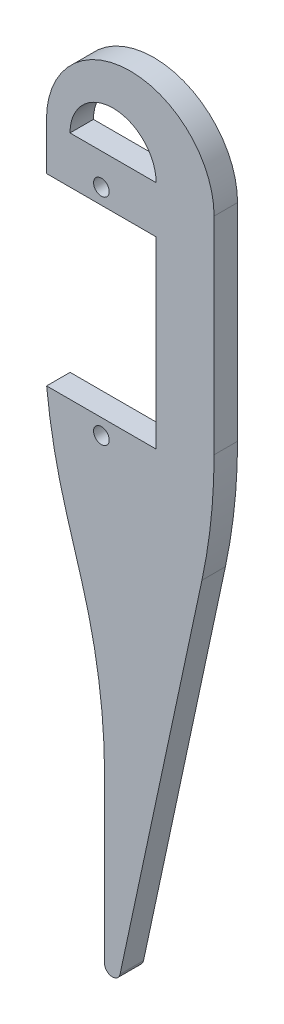
ISO-10303-21;
HEADER;
FILE_DESCRIPTION(('STEP AP214'),'2;1');
FILE_NAME('part.step','',(''),(''),'','','');
FILE_SCHEMA(('AUTOMOTIVE_DESIGN { 1 0 10303 214 1 1 1 1 }'));
ENDSEC;
DATA;
#1=APPLICATION_CONTEXT('core data for automotive mechanical design processes');
#2=APPLICATION_PROTOCOL_DEFINITION('international standard','automotive_design',2000,#1);
#3=PRODUCT_CONTEXT('',#1,'mechanical');
#4=PRODUCT('Part','Part','',(#3));
#5=PRODUCT_RELATED_PRODUCT_CATEGORY('part','',(#4));
#6=PRODUCT_DEFINITION_FORMATION('','',#4);
#7=PRODUCT_DEFINITION_CONTEXT('part definition',#1,'design');
#8=PRODUCT_DEFINITION('design','',#6,#7);
#9=PRODUCT_DEFINITION_SHAPE('','',#8);
#10=(LENGTH_UNIT() NAMED_UNIT(*) SI_UNIT(.MILLI.,.METRE.));
#11=(NAMED_UNIT(*) PLANE_ANGLE_UNIT() SI_UNIT($,.RADIAN.));
#12=(NAMED_UNIT(*) SI_UNIT($,.STERADIAN.) SOLID_ANGLE_UNIT());
#13=UNCERTAINTY_MEASURE_WITH_UNIT(LENGTH_MEASURE(1.E-05),#10,'distance_accuracy_value','');
#14=(GEOMETRIC_REPRESENTATION_CONTEXT(3) GLOBAL_UNCERTAINTY_ASSIGNED_CONTEXT((#13)) GLOBAL_UNIT_ASSIGNED_CONTEXT((#10,
#11,#12)) REPRESENTATION_CONTEXT('',''));
#15=CARTESIAN_POINT('',(0.,0.,0.));
#16=DIRECTION('',(0.,0.,1.));
#17=DIRECTION('',(1.,0.,0.));
#18=AXIS2_PLACEMENT_3D('',#15,#16,#17);
#19=CARTESIAN_POINT('',(-48.5539801961464,24.533720680881,3.));
#20=DIRECTION('',(0.,0.,-1.));
#21=DIRECTION('',(-1.,0.,0.));
#22=AXIS2_PLACEMENT_3D('',#19,#20,#21);
#23=PLANE('',#22);
#24=DIRECTION('',(-1.,0.,0.));
#25=VECTOR('',#24,1.);
#26=CARTESIAN_POINT('',(-45.247809755199,-4.96627931911898,3.));
#27=LINE('',#26,#25);
#28=CARTESIAN_POINT('',(-45.247809755199,-4.96627931911898,3.));
#29=VERTEX_POINT('',#28);
#30=CARTESIAN_POINT('',(-59.247809755199,-4.96627931911899,3.));
#31=VERTEX_POINT('',#30);
#32=EDGE_CURVE('E181',#29,#31,#27,.T.);
#33=ORIENTED_EDGE('',*,*,#32,.T.);
#34=CARTESIAN_POINT('',(10.3897967185846,2.14735298811001,3.));
#35=DIRECTION('',(0.,0.,-1.));
#36=DIRECTION('',(-1.,0.,0.));
#37=AXIS2_PLACEMENT_3D('',#34,#35,#36);
#38=CIRCLE('',#37,70.);
#39=CARTESIAN_POINT('',(-56.6755761014866,-17.9084633379549,3.));
#40=VERTEX_POINT('',#39);
#41=EDGE_CURVE('E252',#31,#40,#38,.F.);
#42=ORIENTED_EDGE('',*,*,#41,.T.);
#43=DIRECTION('',(0.286511661800927,-0.958076754572446,0.));
#44=VECTOR('',#43,1.);
#45=CARTESIAN_POINT('',(-51.8378845095338,-34.0853960006852,3.));
#46=LINE('',#45,#44);
#47=CARTESIAN_POINT('',(-54.7725116894626,-24.2721895617103,3.));
#48=VERTEX_POINT('',#47);
#49=EDGE_CURVE('E183',#40,#48,#46,.T.);
#50=ORIENTED_EDGE('',*,*,#49,.T.);
#51=CARTESIAN_POINT('',(-121.837884509534,-44.3280058877752,3.));
#52=DIRECTION('',(0.,0.,-1.));
#53=DIRECTION('',(-1.,0.,0.));
#54=AXIS2_PLACEMENT_3D('',#51,#52,#53);
#55=CIRCLE('',#54,70.);
#56=CARTESIAN_POINT('',(-51.8378845095338,-44.3280058877752,3.));
#57=VERTEX_POINT('',#56);
#58=EDGE_CURVE('E11',#48,#57,#55,.T.);
#59=ORIENTED_EDGE('',*,*,#58,.T.);
#60=DIRECTION('',(0.,-1.,0.));
#61=VECTOR('',#60,1.);
#62=CARTESIAN_POINT('',(-51.8378845095338,-34.0853960006852,3.));
#63=LINE('',#62,#61);
#64=CARTESIAN_POINT('',(-51.8378845095338,-65.2023030407031,3.));
#65=VERTEX_POINT('',#64);
#66=EDGE_CURVE('E186',#57,#65,#63,.T.);
#67=ORIENTED_EDGE('',*,*,#66,.T.);
#68=CARTESIAN_POINT('',(-50.8378845095338,-65.2023030407034,3.));
#69=DIRECTION('',(0.,0.,1.));
#70=DIRECTION('',(1.,0.,0.));
#71=AXIS2_PLACEMENT_3D('',#68,#69,#70);
#72=CIRCLE('',#71,1.);
#73=CARTESIAN_POINT('',(-49.8600799319517,-65.4118220328244,3.));
#74=VERTEX_POINT('',#73);
#75=EDGE_CURVE('E188',#65,#74,#72,.T.);
#76=ORIENTED_EDGE('',*,*,#75,.T.);
#77=DIRECTION('',(0.209518992121353,0.977804577582071,0.));
#78=VECTOR('',#77,1.);
#79=CARTESIAN_POINT('',(-49.8600799319517,-65.4118220328244,3.));
#80=LINE('',#79,#78);
#81=CARTESIAN_POINT('',(-39.3919202305815,-16.5579478745744,3.));
#82=VERTEX_POINT('',#81);
#83=EDGE_CURVE('E190',#74,#82,#80,.T.);
#84=ORIENTED_EDGE('',*,*,#83,.T.);
#85=CARTESIAN_POINT('',(-107.838240661326,-1.89161842607966,3.));
#86=DIRECTION('',(0.,0.,-1.));
#87=DIRECTION('',(-1.,0.,0.));
#88=AXIS2_PLACEMENT_3D('',#85,#86,#87);
#89=CIRCLE('',#88,70.);
#90=CARTESIAN_POINT('',(-37.8382406613264,-1.89161842607969,3.));
#91=VERTEX_POINT('',#90);
#92=EDGE_CURVE('E49',#82,#91,#89,.F.);
#93=ORIENTED_EDGE('',*,*,#92,.T.);
#94=DIRECTION('',(0.,1.,0.));
#95=VECTOR('',#94,1.);
#96=CARTESIAN_POINT('',(-37.8382406613264,-9.30707777668185,3.));
#97=LINE('',#96,#95);
#98=CARTESIAN_POINT('',(-37.8382406613264,24.533720680881,3.));
#99=VERTEX_POINT('',#98);
#100=EDGE_CURVE('E192',#91,#99,#97,.T.);
#101=ORIENTED_EDGE('',*,*,#100,.T.);
#102=CARTESIAN_POINT('',(-48.5539801961464,24.533720680881,3.));
#103=DIRECTION('',(0.,0.,1.));
#104=DIRECTION('',(-1.,0.,0.));
#105=AXIS2_PLACEMENT_3D('',#102,#103,#104);
#106=CIRCLE('',#105,10.7157395348199);
#107=CARTESIAN_POINT('',(-59.2697197309663,24.533720680881,3.));
#108=VERTEX_POINT('',#107);
#109=EDGE_CURVE('E171',#99,#108,#106,.T.);
#110=ORIENTED_EDGE('',*,*,#109,.T.);
#111=DIRECTION('',(0.,-1.,0.));
#112=VECTOR('',#111,1.);
#113=CARTESIAN_POINT('',(-59.2697197309663,24.533720680881,3.));
#114=LINE('',#113,#112);
#115=CARTESIAN_POINT('',(-59.2697197309663,18.533720680881,3.));
#116=VERTEX_POINT('',#115);
#117=EDGE_CURVE('E174',#108,#116,#114,.T.);
#118=ORIENTED_EDGE('',*,*,#117,.T.);
#119=DIRECTION('',(1.,0.,0.));
#120=VECTOR('',#119,1.);
#121=CARTESIAN_POINT('',(-59.2697197309663,18.533720680881,3.));
#122=LINE('',#121,#120);
#123=CARTESIAN_POINT('',(-45.247809755199,18.533720680881,3.));
#124=VERTEX_POINT('',#123);
#125=EDGE_CURVE('E177',#116,#124,#122,.T.);
#126=ORIENTED_EDGE('',*,*,#125,.T.);
#127=DIRECTION('',(0.,-1.,0.));
#128=VECTOR('',#127,1.);
#129=CARTESIAN_POINT('',(-45.247809755199,18.533720680881,3.));
#130=LINE('',#129,#128);
#131=EDGE_CURVE('E179',#124,#29,#130,.T.);
#132=ORIENTED_EDGE('',*,*,#131,.T.);
#133=EDGE_LOOP('',(#33,#42,#50,#59,#67,#76,#84,#93,#101,#110,#118,#126,#132));
#134=FACE_BOUND('',#133,.T.);
#135=CARTESIAN_POINT('',(-50.7532872491408,24.533720680881,3.));
#136=DIRECTION('',(0.,0.,1.));
#137=DIRECTION('',(1.,0.,0.));
#138=AXIS2_PLACEMENT_3D('',#135,#136,#137);
#139=CIRCLE('',#138,5.50547749394183);
#140=CARTESIAN_POINT('',(-45.247809755199,24.533720680881,3.));
#141=VERTEX_POINT('',#140);
#142=CARTESIAN_POINT('',(-56.2587647430826,24.533720680881,3.));
#143=VERTEX_POINT('',#142);
#144=EDGE_CURVE('E152',#141,#143,#139,.T.);
#145=ORIENTED_EDGE('',*,*,#144,.F.);
#146=DIRECTION('',(1.,0.,0.));
#147=VECTOR('',#146,1.);
#148=CARTESIAN_POINT('',(-45.247809755199,24.533720680881,3.));
#149=LINE('',#148,#147);
#150=EDGE_CURVE('E142',#143,#141,#149,.T.);
#151=ORIENTED_EDGE('',*,*,#150,.F.);
#152=EDGE_LOOP('',(#145,#151));
#153=FACE_BOUND('',#152,.T.);
#154=CARTESIAN_POINT('',(-52.247809755199,20.533720680881,3.));
#155=DIRECTION('',(0.,0.,1.));
#156=DIRECTION('',(1.,0.,0.));
#157=AXIS2_PLACEMENT_3D('',#154,#155,#156);
#158=CIRCLE('',#157,0.999999999999998);
#159=CARTESIAN_POINT('',(-51.247809755199,20.533720680881,3.));
#160=VERTEX_POINT('',#159);
#161=EDGE_CURVE('E167',#160,#160,#158,.T.);
#162=ORIENTED_EDGE('',*,*,#161,.F.);
#163=EDGE_LOOP('',(#162));
#164=FACE_BOUND('',#163,.T.);
#165=CARTESIAN_POINT('',(-52.247809755199,-6.96627931911898,3.));
#166=DIRECTION('',(0.,0.,1.));
#167=DIRECTION('',(1.,0.,0.));
#168=AXIS2_PLACEMENT_3D('',#165,#166,#167);
#169=CIRCLE('',#168,0.999999999999998);
#170=CARTESIAN_POINT('',(-51.247809755199,-6.96627931911898,3.));
#171=VERTEX_POINT('',#170);
#172=EDGE_CURVE('E485',#171,#171,#169,.T.);
#173=ORIENTED_EDGE('',*,*,#172,.F.);
#174=EDGE_LOOP('',(#173));
#175=FACE_BOUND('',#174,.T.);
#176=ADVANCED_FACE('F34',(#134,#153,#164,#175),#23,.F.);
#177=CARTESIAN_POINT('',(-48.5539801961464,24.533720680881,0.));
#178=DIRECTION('',(0.,0.,-1.));
#179=DIRECTION('',(-1.,0.,0.));
#180=AXIS2_PLACEMENT_3D('',#177,#178,#179);
#181=PLANE('',#180);
#182=CARTESIAN_POINT('',(-52.247809755199,20.533720680881,0.));
#183=DIRECTION('',(0.,0.,1.));
#184=DIRECTION('',(1.,0.,0.));
#185=AXIS2_PLACEMENT_3D('',#182,#183,#184);
#186=CIRCLE('',#185,0.999999999999998);
#187=CARTESIAN_POINT('',(-51.247809755199,20.533720680881,0.));
#188=VERTEX_POINT('',#187);
#189=EDGE_CURVE('E164',#188,#188,#186,.T.);
#190=ORIENTED_EDGE('',*,*,#189,.T.);
#191=EDGE_LOOP('',(#190));
#192=FACE_BOUND('',#191,.T.);
#193=DIRECTION('',(0.286511661800927,-0.958076754572446,0.));
#194=VECTOR('',#193,1.);
#195=CARTESIAN_POINT('',(-51.8378845095338,-34.0853960006852,0.));
#196=LINE('',#195,#194);
#197=CARTESIAN_POINT('',(-56.6755761014866,-17.9084633379549,0.));
#198=VERTEX_POINT('',#197);
#199=CARTESIAN_POINT('',(-54.7725116894626,-24.2721895617103,0.));
#200=VERTEX_POINT('',#199);
#201=EDGE_CURVE('E206',#198,#200,#196,.T.);
#202=ORIENTED_EDGE('',*,*,#201,.F.);
#203=CARTESIAN_POINT('',(10.3897967185846,2.14735298811001,0.));
#204=DIRECTION('',(0.,0.,-1.));
#205=DIRECTION('',(-1.,0.,0.));
#206=AXIS2_PLACEMENT_3D('',#203,#204,#205);
#207=CIRCLE('',#206,70.);
#208=CARTESIAN_POINT('',(-59.247809755199,-4.96627931911899,0.));
#209=VERTEX_POINT('',#208);
#210=EDGE_CURVE('E249',#198,#209,#207,.T.);
#211=ORIENTED_EDGE('',*,*,#210,.T.);
#212=DIRECTION('',(-1.,0.,0.));
#213=VECTOR('',#212,1.);
#214=CARTESIAN_POINT('',(-45.247809755199,-4.96627931911898,0.));
#215=LINE('',#214,#213);
#216=CARTESIAN_POINT('',(-45.247809755199,-4.96627931911898,0.));
#217=VERTEX_POINT('',#216);
#218=EDGE_CURVE('E203',#217,#209,#215,.T.);
#219=ORIENTED_EDGE('',*,*,#218,.F.);
#220=DIRECTION('',(0.,-1.,0.));
#221=VECTOR('',#220,1.);
#222=CARTESIAN_POINT('',(-45.247809755199,18.533720680881,0.));
#223=LINE('',#222,#221);
#224=CARTESIAN_POINT('',(-45.247809755199,18.533720680881,0.));
#225=VERTEX_POINT('',#224);
#226=EDGE_CURVE('E201',#225,#217,#223,.T.);
#227=ORIENTED_EDGE('',*,*,#226,.F.);
#228=DIRECTION('',(1.,0.,0.));
#229=VECTOR('',#228,1.);
#230=CARTESIAN_POINT('',(-59.2697197309663,18.533720680881,0.));
#231=LINE('',#230,#229);
#232=CARTESIAN_POINT('',(-59.2697197309663,18.533720680881,0.));
#233=VERTEX_POINT('',#232);
#234=EDGE_CURVE('E199',#233,#225,#231,.T.);
#235=ORIENTED_EDGE('',*,*,#234,.F.);
#236=DIRECTION('',(0.,-1.,0.));
#237=VECTOR('',#236,1.);
#238=CARTESIAN_POINT('',(-59.2697197309663,24.533720680881,0.));
#239=LINE('',#238,#237);
#240=CARTESIAN_POINT('',(-59.2697197309663,24.533720680881,0.));
#241=VERTEX_POINT('',#240);
#242=EDGE_CURVE('E197',#241,#233,#239,.T.);
#243=ORIENTED_EDGE('',*,*,#242,.F.);
#244=CARTESIAN_POINT('',(-48.5539801961464,24.533720680881,0.));
#245=DIRECTION('',(0.,0.,1.));
#246=DIRECTION('',(-1.,0.,0.));
#247=AXIS2_PLACEMENT_3D('',#244,#245,#246);
#248=CIRCLE('',#247,10.7157395348199);
#249=CARTESIAN_POINT('',(-37.8382406613264,24.533720680881,0.));
#250=VERTEX_POINT('',#249);
#251=EDGE_CURVE('E170',#250,#241,#248,.T.);
#252=ORIENTED_EDGE('',*,*,#251,.F.);
#253=DIRECTION('',(0.,1.,0.));
#254=VECTOR('',#253,1.);
#255=CARTESIAN_POINT('',(-37.8382406613264,-9.30707777668185,0.));
#256=LINE('',#255,#254);
#257=CARTESIAN_POINT('',(-37.8382406613264,-1.89161842607969,0.));
#258=VERTEX_POINT('',#257);
#259=EDGE_CURVE('E175',#258,#250,#256,.T.);
#260=ORIENTED_EDGE('',*,*,#259,.F.);
#261=CARTESIAN_POINT('',(-107.838240661326,-1.89161842607966,0.));
#262=DIRECTION('',(0.,0.,-1.));
#263=DIRECTION('',(-1.,0.,0.));
#264=AXIS2_PLACEMENT_3D('',#261,#262,#263);
#265=CIRCLE('',#264,70.);
#266=CARTESIAN_POINT('',(-39.3919202305815,-16.5579478745744,0.));
#267=VERTEX_POINT('',#266);
#268=EDGE_CURVE('E247',#258,#267,#265,.T.);
#269=ORIENTED_EDGE('',*,*,#268,.T.);
#270=DIRECTION('',(0.209518992121353,0.977804577582071,0.));
#271=VECTOR('',#270,1.);
#272=CARTESIAN_POINT('',(-49.8600799319517,-65.4118220328244,0.));
#273=LINE('',#272,#271);
#274=CARTESIAN_POINT('',(-49.8600799319517,-65.4118220328244,0.));
#275=VERTEX_POINT('',#274);
#276=EDGE_CURVE('E213',#275,#267,#273,.T.);
#277=ORIENTED_EDGE('',*,*,#276,.F.);
#278=CARTESIAN_POINT('',(-50.8378845095338,-65.2023030407034,0.));
#279=DIRECTION('',(0.,0.,1.));
#280=DIRECTION('',(1.,0.,0.));
#281=AXIS2_PLACEMENT_3D('',#278,#279,#280);
#282=CIRCLE('',#281,1.);
#283=CARTESIAN_POINT('',(-51.8378845095338,-65.2023030407031,0.));
#284=VERTEX_POINT('',#283);
#285=EDGE_CURVE('E211',#284,#275,#282,.T.);
#286=ORIENTED_EDGE('',*,*,#285,.F.);
#287=DIRECTION('',(0.,-1.,0.));
#288=VECTOR('',#287,1.);
#289=CARTESIAN_POINT('',(-51.8378845095338,-34.0853960006852,0.));
#290=LINE('',#289,#288);
#291=CARTESIAN_POINT('',(-51.8378845095338,-44.3280058877752,0.));
#292=VERTEX_POINT('',#291);
#293=EDGE_CURVE('E209',#292,#284,#290,.T.);
#294=ORIENTED_EDGE('',*,*,#293,.F.);
#295=CARTESIAN_POINT('',(-121.837884509534,-44.3280058877752,0.));
#296=DIRECTION('',(0.,0.,-1.));
#297=DIRECTION('',(-1.,0.,0.));
#298=AXIS2_PLACEMENT_3D('',#295,#296,#297);
#299=CIRCLE('',#298,70.);
#300=EDGE_CURVE('E42',#292,#200,#299,.F.);
#301=ORIENTED_EDGE('',*,*,#300,.T.);
#302=EDGE_LOOP('',(#202,#211,#219,#227,#235,#243,#252,#260,#269,#277,#286,#294,#301));
#303=FACE_BOUND('',#302,.T.);
#304=DIRECTION('',(1.,0.,0.));
#305=VECTOR('',#304,1.);
#306=CARTESIAN_POINT('',(-45.247809755199,24.533720680881,0.));
#307=LINE('',#306,#305);
#308=CARTESIAN_POINT('',(-56.2587647430826,24.533720680881,0.));
#309=VERTEX_POINT('',#308);
#310=CARTESIAN_POINT('',(-45.247809755199,24.533720680881,0.));
#311=VERTEX_POINT('',#310);
#312=EDGE_CURVE('E160',#309,#311,#307,.T.);
#313=ORIENTED_EDGE('',*,*,#312,.T.);
#314=CARTESIAN_POINT('',(-50.7532872491408,24.533720680881,0.));
#315=DIRECTION('',(0.,0.,1.));
#316=DIRECTION('',(1.,0.,0.));
#317=AXIS2_PLACEMENT_3D('',#314,#315,#316);
#318=CIRCLE('',#317,5.50547749394183);
#319=EDGE_CURVE('E157',#311,#309,#318,.T.);
#320=ORIENTED_EDGE('',*,*,#319,.T.);
#321=EDGE_LOOP('',(#313,#320));
#322=FACE_BOUND('',#321,.T.);
#323=CARTESIAN_POINT('',(-52.247809755199,-6.96627931911898,0.));
#324=DIRECTION('',(0.,0.,1.));
#325=DIRECTION('',(1.,0.,0.));
#326=AXIS2_PLACEMENT_3D('',#323,#324,#325);
#327=CIRCLE('',#326,0.999999999999998);
#328=CARTESIAN_POINT('',(-51.247809755199,-6.96627931911898,0.));
#329=VERTEX_POINT('',#328);
#330=EDGE_CURVE('E488',#329,#329,#327,.T.);
#331=ORIENTED_EDGE('',*,*,#330,.T.);
#332=EDGE_LOOP('',(#331));
#333=FACE_BOUND('',#332,.T.);
#334=ADVANCED_FACE('F260',(#192,#303,#322,#333),#181,.T.);
#335=CARTESIAN_POINT('',(-48.5539801961464,24.533720680881,3.));
#336=DIRECTION('',(0.,0.,-1.));
#337=DIRECTION('',(-1.,0.,0.));
#338=AXIS2_PLACEMENT_3D('',#335,#336,#337);
#339=CYLINDRICAL_SURFACE('',#338,10.7157395348199);
#340=ORIENTED_EDGE('',*,*,#251,.T.);
#341=DIRECTION('',(0.,0.,-1.));
#342=VECTOR('',#341,1.);
#343=CARTESIAN_POINT('',(-59.2697197309663,24.533720680881,3.));
#344=LINE('',#343,#342);
#345=EDGE_CURVE('E236',#108,#241,#344,.T.);
#346=ORIENTED_EDGE('',*,*,#345,.F.);
#347=ORIENTED_EDGE('',*,*,#109,.F.);
#348=DIRECTION('',(0.,0.,-1.));
#349=VECTOR('',#348,1.);
#350=CARTESIAN_POINT('',(-37.8382406613264,24.533720680881,3.));
#351=LINE('',#350,#349);
#352=EDGE_CURVE('E194',#99,#250,#351,.T.);
#353=ORIENTED_EDGE('',*,*,#352,.T.);
#354=EDGE_LOOP('',(#340,#346,#347,#353));
#355=FACE_BOUND('',#354,.T.);
#356=ADVANCED_FACE('F291',(#355),#339,.T.);
#357=CARTESIAN_POINT('',(-59.2697197309663,24.533720680881,3.));
#358=DIRECTION('',(1.,0.,0.));
#359=DIRECTION('',(0.,0.,-1.));
#360=AXIS2_PLACEMENT_3D('',#357,#358,#359);
#361=PLANE('',#360);
#362=ORIENTED_EDGE('',*,*,#242,.T.);
#363=DIRECTION('',(0.,0.,-1.));
#364=VECTOR('',#363,1.);
#365=CARTESIAN_POINT('',(-59.2697197309663,18.533720680881,3.));
#366=LINE('',#365,#364);
#367=EDGE_CURVE('E233',#116,#233,#366,.T.);
#368=ORIENTED_EDGE('',*,*,#367,.F.);
#369=ORIENTED_EDGE('',*,*,#117,.F.);
#370=ORIENTED_EDGE('',*,*,#345,.T.);
#371=EDGE_LOOP('',(#362,#368,#369,#370));
#372=FACE_BOUND('',#371,.T.);
#373=ADVANCED_FACE('F297',(#372),#361,.F.);
#374=CARTESIAN_POINT('',(-59.2697197309663,18.533720680881,3.));
#375=DIRECTION('',(0.,1.,0.));
#376=DIRECTION('',(0.,0.,1.));
#377=AXIS2_PLACEMENT_3D('',#374,#375,#376);
#378=PLANE('',#377);
#379=ORIENTED_EDGE('',*,*,#234,.T.);
#380=DIRECTION('',(0.,0.,-1.));
#381=VECTOR('',#380,1.);
#382=CARTESIAN_POINT('',(-45.247809755199,18.533720680881,3.));
#383=LINE('',#382,#381);
#384=EDGE_CURVE('E230',#124,#225,#383,.T.);
#385=ORIENTED_EDGE('',*,*,#384,.F.);
#386=ORIENTED_EDGE('',*,*,#125,.F.);
#387=ORIENTED_EDGE('',*,*,#367,.T.);
#388=EDGE_LOOP('',(#379,#385,#386,#387));
#389=FACE_BOUND('',#388,.T.);
#390=ADVANCED_FACE('F299',(#389),#378,.F.);
#391=CARTESIAN_POINT('',(-45.247809755199,18.533720680881,3.));
#392=DIRECTION('',(1.,0.,0.));
#393=DIRECTION('',(0.,0.,-1.));
#394=AXIS2_PLACEMENT_3D('',#391,#392,#393);
#395=PLANE('',#394);
#396=ORIENTED_EDGE('',*,*,#226,.T.);
#397=DIRECTION('',(0.,0.,-1.));
#398=VECTOR('',#397,1.);
#399=CARTESIAN_POINT('',(-45.247809755199,-4.96627931911898,3.));
#400=LINE('',#399,#398);
#401=EDGE_CURVE('E227',#29,#217,#400,.T.);
#402=ORIENTED_EDGE('',*,*,#401,.F.);
#403=ORIENTED_EDGE('',*,*,#131,.F.);
#404=ORIENTED_EDGE('',*,*,#384,.T.);
#405=EDGE_LOOP('',(#396,#402,#403,#404));
#406=FACE_BOUND('',#405,.T.);
#407=ADVANCED_FACE('F304',(#406),#395,.F.);
#408=CARTESIAN_POINT('',(-45.247809755199,-4.96627931911898,3.));
#409=DIRECTION('',(0.,-1.,0.));
#410=DIRECTION('',(1.,0.,0.));
#411=AXIS2_PLACEMENT_3D('',#408,#409,#410);
#412=PLANE('',#411);
#413=ORIENTED_EDGE('',*,*,#218,.T.);
#414=DIRECTION('',(0.,0.,-1.));
#415=VECTOR('',#414,1.);
#416=CARTESIAN_POINT('',(-59.247809755199,-4.96627931911899,3.));
#417=LINE('',#416,#415);
#418=EDGE_CURVE('E224',#31,#209,#417,.T.);
#419=ORIENTED_EDGE('',*,*,#418,.F.);
#420=ORIENTED_EDGE('',*,*,#32,.F.);
#421=ORIENTED_EDGE('',*,*,#401,.T.);
#422=EDGE_LOOP('',(#413,#419,#420,#421));
#423=FACE_BOUND('',#422,.T.);
#424=ADVANCED_FACE('F309',(#423),#412,.F.);
#425=CARTESIAN_POINT('',(-51.8378845095338,-34.0853960006852,3.));
#426=DIRECTION('',(0.958076754572446,0.286511661800927,0.));
#427=DIRECTION('',(-0.286511661800927,0.958076754572446,0.));
#428=AXIS2_PLACEMENT_3D('',#425,#426,#427);
#429=PLANE('',#428);
#430=ORIENTED_EDGE('',*,*,#201,.T.);
#431=DIRECTION('',(0.,0.,-1.));
#432=VECTOR('',#431,1.);
#433=CARTESIAN_POINT('',(-54.7725116894626,-24.2721895617103,3.));
#434=LINE('',#433,#432);
#435=EDGE_CURVE('E245',#200,#48,#434,.F.);
#436=ORIENTED_EDGE('',*,*,#435,.T.);
#437=ORIENTED_EDGE('',*,*,#49,.F.);
#438=DIRECTION('',(0.,0.,-1.));
#439=VECTOR('',#438,1.);
#440=CARTESIAN_POINT('',(-56.6755761014866,-17.9084633379549,3.));
#441=LINE('',#440,#439);
#442=EDGE_CURVE('E242',#40,#198,#441,.T.);
#443=ORIENTED_EDGE('',*,*,#442,.T.);
#444=EDGE_LOOP('',(#430,#436,#437,#443));
#445=FACE_BOUND('',#444,.T.);
#446=ADVANCED_FACE('F267',(#445),#429,.F.);
#447=CARTESIAN_POINT('',(-51.8378845095338,-34.0853960006852,3.));
#448=DIRECTION('',(1.,0.,0.));
#449=DIRECTION('',(0.,1.,0.));
#450=AXIS2_PLACEMENT_3D('',#447,#448,#449);
#451=PLANE('',#450);
#452=ORIENTED_EDGE('',*,*,#66,.F.);
#453=DIRECTION('',(0.,0.,-1.));
#454=VECTOR('',#453,1.);
#455=CARTESIAN_POINT('',(-51.8378845095338,-44.3280058877752,0.));
#456=LINE('',#455,#454);
#457=EDGE_CURVE('E239',#57,#292,#456,.T.);
#458=ORIENTED_EDGE('',*,*,#457,.T.);
#459=ORIENTED_EDGE('',*,*,#293,.T.);
#460=DIRECTION('',(0.,0.,-1.));
#461=VECTOR('',#460,1.);
#462=CARTESIAN_POINT('',(-51.8378845095338,-65.2023030407031,3.));
#463=LINE('',#462,#461);
#464=EDGE_CURVE('E221',#65,#284,#463,.T.);
#465=ORIENTED_EDGE('',*,*,#464,.F.);
#466=EDGE_LOOP('',(#452,#458,#459,#465));
#467=FACE_BOUND('',#466,.T.);
#468=ADVANCED_FACE('F275',(#467),#451,.F.);
#469=CARTESIAN_POINT('',(-50.8378845095338,-65.2023030407034,3.));
#470=DIRECTION('',(0.,0.,-1.));
#471=DIRECTION('',(-1.,0.,0.));
#472=AXIS2_PLACEMENT_3D('',#469,#470,#471);
#473=CYLINDRICAL_SURFACE('',#472,1.);
#474=ORIENTED_EDGE('',*,*,#285,.T.);
#475=DIRECTION('',(0.,0.,-1.));
#476=VECTOR('',#475,1.);
#477=CARTESIAN_POINT('',(-49.8600799319517,-65.4118220328244,3.));
#478=LINE('',#477,#476);
#479=EDGE_CURVE('E218',#74,#275,#478,.T.);
#480=ORIENTED_EDGE('',*,*,#479,.F.);
#481=ORIENTED_EDGE('',*,*,#75,.F.);
#482=ORIENTED_EDGE('',*,*,#464,.T.);
#483=EDGE_LOOP('',(#474,#480,#481,#482));
#484=FACE_BOUND('',#483,.T.);
#485=ADVANCED_FACE('F279',(#484),#473,.T.);
#486=CARTESIAN_POINT('',(-49.8600799319517,-65.4118220328244,3.));
#487=DIRECTION('',(-0.977804577582071,0.209518992121353,0.));
#488=DIRECTION('',(-0.209518992121353,-0.977804577582071,0.));
#489=AXIS2_PLACEMENT_3D('',#486,#487,#488);
#490=PLANE('',#489);
#491=ORIENTED_EDGE('',*,*,#276,.T.);
#492=DIRECTION('',(0.,0.,-1.));
#493=VECTOR('',#492,1.);
#494=CARTESIAN_POINT('',(-39.3919202305815,-16.5579478745744,3.));
#495=LINE('',#494,#493);
#496=EDGE_CURVE('E57',#267,#82,#495,.F.);
#497=ORIENTED_EDGE('',*,*,#496,.T.);
#498=ORIENTED_EDGE('',*,*,#83,.F.);
#499=ORIENTED_EDGE('',*,*,#479,.T.);
#500=EDGE_LOOP('',(#491,#497,#498,#499));
#501=FACE_BOUND('',#500,.T.);
#502=ADVANCED_FACE('F332',(#501),#490,.F.);
#503=CARTESIAN_POINT('',(-37.8382406613264,-9.30707777668185,3.));
#504=DIRECTION('',(-1.,0.,0.));
#505=DIRECTION('',(0.,-1.,0.));
#506=AXIS2_PLACEMENT_3D('',#503,#504,#505);
#507=PLANE('',#506);
#508=ORIENTED_EDGE('',*,*,#100,.F.);
#509=DIRECTION('',(0.,0.,-1.));
#510=VECTOR('',#509,1.);
#511=CARTESIAN_POINT('',(-37.8382406613264,-1.89161842607969,3.));
#512=LINE('',#511,#510);
#513=EDGE_CURVE('E254',#91,#258,#512,.T.);
#514=ORIENTED_EDGE('',*,*,#513,.T.);
#515=ORIENTED_EDGE('',*,*,#259,.T.);
#516=ORIENTED_EDGE('',*,*,#352,.F.);
#517=EDGE_LOOP('',(#508,#514,#515,#516));
#518=FACE_BOUND('',#517,.T.);
#519=ADVANCED_FACE('F284',(#518),#507,.F.);
#520=CARTESIAN_POINT('',(-50.7532872491408,24.533720680881,3.));
#521=DIRECTION('',(0.,0.,-1.));
#522=DIRECTION('',(-1.,0.,0.));
#523=AXIS2_PLACEMENT_3D('',#520,#521,#522);
#524=CYLINDRICAL_SURFACE('',#523,5.50547749394183);
#525=ORIENTED_EDGE('',*,*,#319,.F.);
#526=DIRECTION('',(0.,0.,-1.));
#527=VECTOR('',#526,1.);
#528=CARTESIAN_POINT('',(-45.247809755199,24.533720680881,3.));
#529=LINE('',#528,#527);
#530=EDGE_CURVE('E145',#141,#311,#529,.T.);
#531=ORIENTED_EDGE('',*,*,#530,.F.);
#532=ORIENTED_EDGE('',*,*,#144,.T.);
#533=DIRECTION('',(0.,0.,-1.));
#534=VECTOR('',#533,1.);
#535=CARTESIAN_POINT('',(-56.2587647430826,24.533720680881,3.));
#536=LINE('',#535,#534);
#537=EDGE_CURVE('E148',#143,#309,#536,.T.);
#538=ORIENTED_EDGE('',*,*,#537,.T.);
#539=EDGE_LOOP('',(#525,#531,#532,#538));
#540=FACE_BOUND('',#539,.T.);
#541=ADVANCED_FACE('F155',(#540),#524,.F.);
#542=CARTESIAN_POINT('',(-45.247809755199,24.533720680881,3.));
#543=DIRECTION('',(0.,1.,0.));
#544=DIRECTION('',(0.,0.,1.));
#545=AXIS2_PLACEMENT_3D('',#542,#543,#544);
#546=PLANE('',#545);
#547=ORIENTED_EDGE('',*,*,#312,.F.);
#548=ORIENTED_EDGE('',*,*,#537,.F.);
#549=ORIENTED_EDGE('',*,*,#150,.T.);
#550=ORIENTED_EDGE('',*,*,#530,.T.);
#551=EDGE_LOOP('',(#547,#548,#549,#550));
#552=FACE_BOUND('',#551,.T.);
#553=ADVANCED_FACE('F144',(#552),#546,.T.);
#554=CARTESIAN_POINT('',(-52.247809755199,20.533720680881,3.));
#555=DIRECTION('',(0.,0.,-1.));
#556=DIRECTION('',(-1.,0.,0.));
#557=AXIS2_PLACEMENT_3D('',#554,#555,#556);
#558=CYLINDRICAL_SURFACE('',#557,0.999999999999998);
#559=ORIENTED_EDGE('',*,*,#161,.T.);
#560=EDGE_LOOP('',(#559));
#561=FACE_BOUND('',#560,.T.);
#562=ORIENTED_EDGE('',*,*,#189,.F.);
#563=EDGE_LOOP('',(#562));
#564=FACE_BOUND('',#563,.T.);
#565=ADVANCED_FACE('F402',(#561,#564),#558,.F.);
#566=CARTESIAN_POINT('',(-52.247809755199,-6.96627931911898,3.));
#567=DIRECTION('',(0.,0.,-1.));
#568=DIRECTION('',(-1.,0.,0.));
#569=AXIS2_PLACEMENT_3D('',#566,#567,#568);
#570=CYLINDRICAL_SURFACE('',#569,0.999999999999998);
#571=ORIENTED_EDGE('',*,*,#172,.T.);
#572=EDGE_LOOP('',(#571));
#573=FACE_BOUND('',#572,.T.);
#574=ORIENTED_EDGE('',*,*,#330,.F.);
#575=EDGE_LOOP('',(#574));
#576=FACE_BOUND('',#575,.T.);
#577=ADVANCED_FACE('F318',(#573,#576),#570,.F.);
#578=CARTESIAN_POINT('',(-121.837884509534,-44.3280058877752,3.));
#579=DIRECTION('',(0.,0.,1.));
#580=DIRECTION('',(1.,0.,0.));
#581=AXIS2_PLACEMENT_3D('',#578,#579,#580);
#582=CYLINDRICAL_SURFACE('',#581,70.);
#583=ORIENTED_EDGE('',*,*,#58,.F.);
#584=ORIENTED_EDGE('',*,*,#435,.F.);
#585=ORIENTED_EDGE('',*,*,#300,.F.);
#586=ORIENTED_EDGE('',*,*,#457,.F.);
#587=EDGE_LOOP('',(#583,#584,#585,#586));
#588=FACE_BOUND('',#587,.T.);
#589=ADVANCED_FACE('F271',(#588),#582,.F.);
#590=CARTESIAN_POINT('',(10.3897967185846,2.14735298811001,3.));
#591=DIRECTION('',(0.,0.,-1.));
#592=DIRECTION('',(-1.,0.,0.));
#593=AXIS2_PLACEMENT_3D('',#590,#591,#592);
#594=CYLINDRICAL_SURFACE('',#593,70.);
#595=ORIENTED_EDGE('',*,*,#41,.F.);
#596=ORIENTED_EDGE('',*,*,#418,.T.);
#597=ORIENTED_EDGE('',*,*,#210,.F.);
#598=ORIENTED_EDGE('',*,*,#442,.F.);
#599=EDGE_LOOP('',(#595,#596,#597,#598));
#600=FACE_BOUND('',#599,.T.);
#601=ADVANCED_FACE('F312',(#600),#594,.T.);
#602=CARTESIAN_POINT('',(-107.838240661326,-1.89161842607966,3.));
#603=DIRECTION('',(0.,0.,-1.));
#604=DIRECTION('',(-1.,0.,0.));
#605=AXIS2_PLACEMENT_3D('',#602,#603,#604);
#606=CYLINDRICAL_SURFACE('',#605,70.);
#607=ORIENTED_EDGE('',*,*,#92,.F.);
#608=ORIENTED_EDGE('',*,*,#496,.F.);
#609=ORIENTED_EDGE('',*,*,#268,.F.);
#610=ORIENTED_EDGE('',*,*,#513,.F.);
#611=EDGE_LOOP('',(#607,#608,#609,#610));
#612=FACE_BOUND('',#611,.T.);
#613=ADVANCED_FACE('F36',(#612),#606,.T.);
#614=CLOSED_SHELL('',(#176,#334,#356,#373,#390,#407,#424,#446,#468,#485,#502,#519,#541,#553,
#565,#577,#589,#601,#613));
#615=MANIFOLD_SOLID_BREP('B2',#614);
#616=ADVANCED_BREP_SHAPE_REPRESENTATION('',(#18,#615),#14);
#617=SHAPE_DEFINITION_REPRESENTATION(#9,#616);
ENDSEC;
END-ISO-10303-21;
